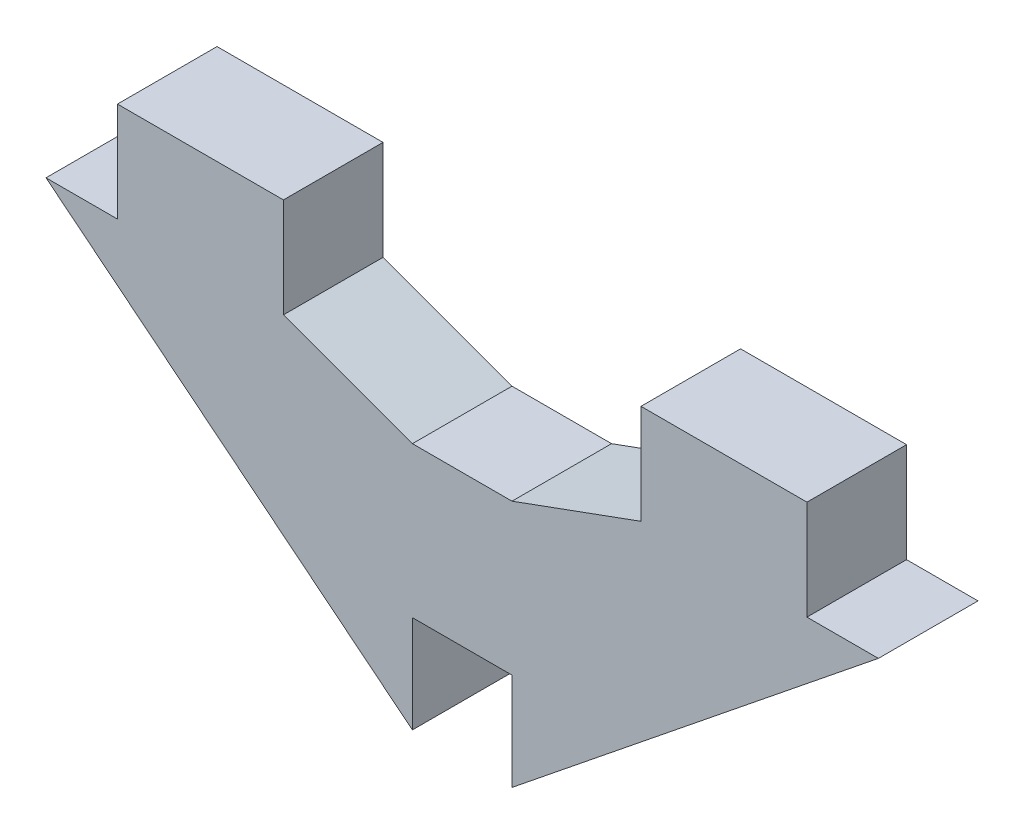
ISO-10303-21;
HEADER;
FILE_DESCRIPTION(('STEP AP214'),'2;1');
FILE_NAME('part.step','',(''),(''),'','','');
FILE_SCHEMA(('AUTOMOTIVE_DESIGN { 1 0 10303 214 1 1 1 1 }'));
ENDSEC;
DATA;
#1=APPLICATION_CONTEXT('core data for automotive mechanical design processes');
#2=APPLICATION_PROTOCOL_DEFINITION('international standard','automotive_design',2000,#1);
#3=PRODUCT_CONTEXT('',#1,'mechanical');
#4=PRODUCT('Part','Part','',(#3));
#5=PRODUCT_RELATED_PRODUCT_CATEGORY('part','',(#4));
#6=PRODUCT_DEFINITION_FORMATION('','',#4);
#7=PRODUCT_DEFINITION_CONTEXT('part definition',#1,'design');
#8=PRODUCT_DEFINITION('design','',#6,#7);
#9=PRODUCT_DEFINITION_SHAPE('','',#8);
#10=(LENGTH_UNIT() NAMED_UNIT(*) SI_UNIT(.MILLI.,.METRE.));
#11=(NAMED_UNIT(*) PLANE_ANGLE_UNIT() SI_UNIT($,.RADIAN.));
#12=(NAMED_UNIT(*) SI_UNIT($,.STERADIAN.) SOLID_ANGLE_UNIT());
#13=UNCERTAINTY_MEASURE_WITH_UNIT(LENGTH_MEASURE(1.E-05),#10,'distance_accuracy_value','');
#14=(GEOMETRIC_REPRESENTATION_CONTEXT(3) GLOBAL_UNCERTAINTY_ASSIGNED_CONTEXT((#13)) GLOBAL_UNIT_ASSIGNED_CONTEXT((#10,
#11,#12)) REPRESENTATION_CONTEXT('',''));
#15=CARTESIAN_POINT('',(0.,0.,0.));
#16=DIRECTION('',(0.,0.,1.));
#17=DIRECTION('',(1.,0.,0.));
#18=AXIS2_PLACEMENT_3D('',#15,#16,#17);
#19=CARTESIAN_POINT('',(1.524,54.2839406039687,1.524));
#20=DIRECTION('',(1.,0.,0.));
#21=DIRECTION('',(0.,0.,-1.));
#22=AXIS2_PLACEMENT_3D('',#19,#20,#21);
#23=PLANE('',#22);
#24=DIRECTION('',(0.,-1.,0.));
#25=VECTOR('',#24,1.);
#26=CARTESIAN_POINT('',(1.524,54.2839406039687,0.));
#27=LINE('',#26,#25);
#28=CARTESIAN_POINT('',(1.524,54.2839406039687,0.));
#29=VERTEX_POINT('',#28);
#30=CARTESIAN_POINT('',(1.524,52.7953081006558,0.));
#31=VERTEX_POINT('',#30);
#32=EDGE_CURVE('E176',#29,#31,#27,.T.);
#33=ORIENTED_EDGE('',*,*,#32,.T.);
#34=DIRECTION('',(0.,0.,-1.));
#35=VECTOR('',#34,1.);
#36=CARTESIAN_POINT('',(1.524,52.7953081006558,1.524));
#37=LINE('',#36,#35);
#38=CARTESIAN_POINT('',(1.524,52.7953081006558,1.524));
#39=VERTEX_POINT('',#38);
#40=EDGE_CURVE('E11',#39,#31,#37,.T.);
#41=ORIENTED_EDGE('',*,*,#40,.F.);
#42=DIRECTION('',(0.,-1.,0.));
#43=VECTOR('',#42,1.);
#44=CARTESIAN_POINT('',(1.524,54.2839406039687,1.524));
#45=LINE('',#44,#43);
#46=CARTESIAN_POINT('',(1.524,54.2839406039687,1.524));
#47=VERTEX_POINT('',#46);
#48=EDGE_CURVE('E206',#47,#39,#45,.T.);
#49=ORIENTED_EDGE('',*,*,#48,.F.);
#50=DIRECTION('',(0.,0.,-1.));
#51=VECTOR('',#50,1.);
#52=CARTESIAN_POINT('',(1.524,54.2839406039687,1.524));
#53=LINE('',#52,#51);
#54=EDGE_CURVE('E172',#47,#29,#53,.T.);
#55=ORIENTED_EDGE('',*,*,#54,.T.);
#56=EDGE_LOOP('',(#33,#41,#49,#55));
#57=FACE_BOUND('',#56,.T.);
#58=ADVANCED_FACE('F32',(#57),#23,.F.);
#59=CARTESIAN_POINT('',(1.524,52.7953081006558,1.524));
#60=DIRECTION('',(-0.627078143312638,0.778956354476664,0.));
#61=DIRECTION('',(-0.778956354476664,-0.627078143312638,0.));
#62=AXIS2_PLACEMENT_3D('',#59,#60,#61);
#63=PLANE('',#62);
#64=DIRECTION('',(0.778956354476664,0.627078143312638,0.));
#65=VECTOR('',#64,1.);
#66=CARTESIAN_POINT('',(1.524,52.7953081006558,0.));
#67=LINE('',#66,#65);
#68=CARTESIAN_POINT('',(7.13130325709699,57.3093187961763,0.));
#69=VERTEX_POINT('',#68);
#70=EDGE_CURVE('E179',#31,#69,#67,.T.);
#71=ORIENTED_EDGE('',*,*,#70,.T.);
#72=DIRECTION('',(0.,0.,-1.));
#73=VECTOR('',#72,1.);
#74=CARTESIAN_POINT('',(7.13130325709699,57.3093187961763,1.524));
#75=LINE('',#74,#73);
#76=CARTESIAN_POINT('',(7.13130325709699,57.3093187961763,1.524));
#77=VERTEX_POINT('',#76);
#78=EDGE_CURVE('E40',#77,#69,#75,.T.);
#79=ORIENTED_EDGE('',*,*,#78,.F.);
#80=DIRECTION('',(0.778956354476664,0.627078143312638,0.));
#81=VECTOR('',#80,1.);
#82=CARTESIAN_POINT('',(1.524,52.7953081006558,1.524));
#83=LINE('',#82,#81);
#84=EDGE_CURVE('E115',#39,#77,#83,.T.);
#85=ORIENTED_EDGE('',*,*,#84,.F.);
#86=ORIENTED_EDGE('',*,*,#40,.T.);
#87=EDGE_LOOP('',(#71,#79,#85,#86));
#88=FACE_BOUND('',#87,.T.);
#89=ADVANCED_FACE('F304',(#88),#63,.F.);
#90=CARTESIAN_POINT('',(7.13130325709699,57.3093187961763,1.524));
#91=DIRECTION('',(0.,-1.,0.));
#92=DIRECTION('',(0.,0.,-1.));
#93=AXIS2_PLACEMENT_3D('',#90,#91,#92);
#94=PLANE('',#93);
#95=DIRECTION('',(-1.,0.,0.));
#96=VECTOR('',#95,1.);
#97=CARTESIAN_POINT('',(7.13130325709699,57.3093187961763,0.));
#98=LINE('',#97,#96);
#99=CARTESIAN_POINT('',(6.03787126377507,57.3093187961763,0.));
#100=VERTEX_POINT('',#99);
#101=EDGE_CURVE('E181',#69,#100,#98,.T.);
#102=ORIENTED_EDGE('',*,*,#101,.T.);
#103=DIRECTION('',(0.,0.,-1.));
#104=VECTOR('',#103,1.);
#105=CARTESIAN_POINT('',(6.03787126377507,57.3093187961763,1.524));
#106=LINE('',#105,#104);
#107=CARTESIAN_POINT('',(6.03787126377507,57.3093187961763,1.524));
#108=VERTEX_POINT('',#107);
#109=EDGE_CURVE('E237',#108,#100,#106,.T.);
#110=ORIENTED_EDGE('',*,*,#109,.F.);
#111=DIRECTION('',(-1.,0.,0.));
#112=VECTOR('',#111,1.);
#113=CARTESIAN_POINT('',(7.13130325709699,57.3093187961763,1.524));
#114=LINE('',#113,#112);
#115=EDGE_CURVE('E245',#77,#108,#114,.T.);
#116=ORIENTED_EDGE('',*,*,#115,.F.);
#117=ORIENTED_EDGE('',*,*,#78,.T.);
#118=EDGE_LOOP('',(#102,#110,#116,#117));
#119=FACE_BOUND('',#118,.T.);
#120=ADVANCED_FACE('F243',(#119),#94,.F.);
#121=CARTESIAN_POINT('',(6.03787126377507,57.3093187961763,1.524));
#122=DIRECTION('',(-1.,0.,0.));
#123=DIRECTION('',(0.,0.,1.));
#124=AXIS2_PLACEMENT_3D('',#121,#122,#123);
#125=PLANE('',#124);
#126=DIRECTION('',(0.,1.,0.));
#127=VECTOR('',#126,1.);
#128=CARTESIAN_POINT('',(6.03787126377507,57.3093187961763,0.));
#129=LINE('',#128,#127);
#130=CARTESIAN_POINT('',(6.03787126377507,58.8333187961763,0.));
#131=VERTEX_POINT('',#130);
#132=EDGE_CURVE('E183',#100,#131,#129,.T.);
#133=ORIENTED_EDGE('',*,*,#132,.T.);
#134=DIRECTION('',(0.,0.,-1.));
#135=VECTOR('',#134,1.);
#136=CARTESIAN_POINT('',(6.03787126377507,58.8333187961763,1.524));
#137=LINE('',#136,#135);
#138=CARTESIAN_POINT('',(6.03787126377507,58.8333187961763,1.524));
#139=VERTEX_POINT('',#138);
#140=EDGE_CURVE('E234',#139,#131,#137,.T.);
#141=ORIENTED_EDGE('',*,*,#140,.F.);
#142=DIRECTION('',(0.,1.,0.));
#143=VECTOR('',#142,1.);
#144=CARTESIAN_POINT('',(6.03787126377507,57.3093187961763,1.524));
#145=LINE('',#144,#143);
#146=EDGE_CURVE('E263',#108,#139,#145,.T.);
#147=ORIENTED_EDGE('',*,*,#146,.F.);
#148=ORIENTED_EDGE('',*,*,#109,.T.);
#149=EDGE_LOOP('',(#133,#141,#147,#148));
#150=FACE_BOUND('',#149,.T.);
#151=ADVANCED_FACE('F254',(#150),#125,.F.);
#152=CARTESIAN_POINT('',(6.03787126377507,58.8333187961763,1.524));
#153=DIRECTION('',(0.,-1.,0.));
#154=DIRECTION('',(0.,0.,-1.));
#155=AXIS2_PLACEMENT_3D('',#152,#153,#154);
#156=PLANE('',#155);
#157=DIRECTION('',(-1.,0.,0.));
#158=VECTOR('',#157,1.);
#159=CARTESIAN_POINT('',(6.03787126377507,58.8333187961763,0.));
#160=LINE('',#159,#158);
#161=CARTESIAN_POINT('',(3.49787126377506,58.8333187961763,0.));
#162=VERTEX_POINT('',#161);
#163=EDGE_CURVE('E185',#131,#162,#160,.T.);
#164=ORIENTED_EDGE('',*,*,#163,.T.);
#165=DIRECTION('',(0.,0.,-1.));
#166=VECTOR('',#165,1.);
#167=CARTESIAN_POINT('',(3.49787126377506,58.8333187961763,1.524));
#168=LINE('',#167,#166);
#169=CARTESIAN_POINT('',(3.49787126377506,58.8333187961763,1.524));
#170=VERTEX_POINT('',#169);
#171=EDGE_CURVE('E231',#170,#162,#168,.T.);
#172=ORIENTED_EDGE('',*,*,#171,.F.);
#173=DIRECTION('',(-1.,0.,0.));
#174=VECTOR('',#173,1.);
#175=CARTESIAN_POINT('',(6.03787126377507,58.8333187961763,1.524));
#176=LINE('',#175,#174);
#177=EDGE_CURVE('E260',#139,#170,#176,.T.);
#178=ORIENTED_EDGE('',*,*,#177,.F.);
#179=ORIENTED_EDGE('',*,*,#140,.T.);
#180=EDGE_LOOP('',(#164,#172,#178,#179));
#181=FACE_BOUND('',#180,.T.);
#182=ADVANCED_FACE('F258',(#181),#156,.F.);
#183=CARTESIAN_POINT('',(3.49787126377506,58.8333187961763,1.524));
#184=DIRECTION('',(1.,0.,0.));
#185=DIRECTION('',(0.,0.,-1.));
#186=AXIS2_PLACEMENT_3D('',#183,#184,#185);
#187=PLANE('',#186);
#188=DIRECTION('',(0.,-1.,0.));
#189=VECTOR('',#188,1.);
#190=CARTESIAN_POINT('',(3.49787126377506,58.8333187961763,0.));
#191=LINE('',#190,#189);
#192=CARTESIAN_POINT('',(3.49787126377506,57.3093187961763,0.));
#193=VERTEX_POINT('',#192);
#194=EDGE_CURVE('E187',#162,#193,#191,.T.);
#195=ORIENTED_EDGE('',*,*,#194,.T.);
#196=DIRECTION('',(0.,0.,-1.));
#197=VECTOR('',#196,1.);
#198=CARTESIAN_POINT('',(3.49787126377506,57.3093187961763,1.524));
#199=LINE('',#198,#197);
#200=CARTESIAN_POINT('',(3.49787126377506,57.3093187961763,1.524));
#201=VERTEX_POINT('',#200);
#202=EDGE_CURVE('E228',#201,#193,#199,.T.);
#203=ORIENTED_EDGE('',*,*,#202,.F.);
#204=DIRECTION('',(0.,-1.,0.));
#205=VECTOR('',#204,1.);
#206=CARTESIAN_POINT('',(3.49787126377506,58.8333187961763,1.524));
#207=LINE('',#206,#205);
#208=EDGE_CURVE('E262',#170,#201,#207,.T.);
#209=ORIENTED_EDGE('',*,*,#208,.F.);
#210=ORIENTED_EDGE('',*,*,#171,.T.);
#211=EDGE_LOOP('',(#195,#203,#209,#210));
#212=FACE_BOUND('',#211,.T.);
#213=ADVANCED_FACE('F317',(#212),#187,.F.);
#214=CARTESIAN_POINT('',(1.524,56.5893477170582,1.524));
#215=DIRECTION('',(0.342667570889591,-0.939456723782755,0.));
#216=DIRECTION('',(0.939456723782755,0.342667570889591,0.));
#217=AXIS2_PLACEMENT_3D('',#214,#215,#216);
#218=PLANE('',#217);
#219=DIRECTION('',(-0.939456723782755,-0.342667570889591,0.));
#220=VECTOR('',#219,1.);
#221=CARTESIAN_POINT('',(1.524,56.5893477170582,0.));
#222=LINE('',#221,#220);
#223=CARTESIAN_POINT('',(1.524,56.5893477170582,0.));
#224=VERTEX_POINT('',#223);
#225=EDGE_CURVE('E189',#193,#224,#222,.T.);
#226=ORIENTED_EDGE('',*,*,#225,.T.);
#227=DIRECTION('',(0.,0.,-1.));
#228=VECTOR('',#227,1.);
#229=CARTESIAN_POINT('',(1.524,56.5893477170582,1.524));
#230=LINE('',#229,#228);
#231=CARTESIAN_POINT('',(1.524,56.5893477170582,1.524));
#232=VERTEX_POINT('',#231);
#233=EDGE_CURVE('E225',#232,#224,#230,.T.);
#234=ORIENTED_EDGE('',*,*,#233,.F.);
#235=DIRECTION('',(-0.939456723782755,-0.342667570889591,0.));
#236=VECTOR('',#235,1.);
#237=CARTESIAN_POINT('',(1.524,56.5893477170582,1.524));
#238=LINE('',#237,#236);
#239=EDGE_CURVE('E265',#201,#232,#238,.T.);
#240=ORIENTED_EDGE('',*,*,#239,.F.);
#241=ORIENTED_EDGE('',*,*,#202,.T.);
#242=EDGE_LOOP('',(#226,#234,#240,#241));
#243=FACE_BOUND('',#242,.T.);
#244=ADVANCED_FACE('F320',(#243),#218,.F.);
#245=CARTESIAN_POINT('',(0.,56.5893477170582,1.524));
#246=DIRECTION('',(0.,-1.,0.));
#247=DIRECTION('',(0.,0.,-1.));
#248=AXIS2_PLACEMENT_3D('',#245,#246,#247);
#249=PLANE('',#248);
#250=DIRECTION('',(-1.,0.,0.));
#251=VECTOR('',#250,1.);
#252=CARTESIAN_POINT('',(0.,56.5893477170582,0.));
#253=LINE('',#252,#251);
#254=CARTESIAN_POINT('',(0.,56.5893477170582,0.));
#255=VERTEX_POINT('',#254);
#256=EDGE_CURVE('E191',#224,#255,#253,.T.);
#257=ORIENTED_EDGE('',*,*,#256,.T.);
#258=DIRECTION('',(0.,0.,-1.));
#259=VECTOR('',#258,1.);
#260=CARTESIAN_POINT('',(0.,56.5893477170582,1.524));
#261=LINE('',#260,#259);
#262=CARTESIAN_POINT('',(0.,56.5893477170582,1.524));
#263=VERTEX_POINT('',#262);
#264=EDGE_CURVE('E222',#263,#255,#261,.T.);
#265=ORIENTED_EDGE('',*,*,#264,.F.);
#266=DIRECTION('',(-1.,0.,0.));
#267=VECTOR('',#266,1.);
#268=CARTESIAN_POINT('',(0.,56.5893477170582,1.524));
#269=LINE('',#268,#267);
#270=EDGE_CURVE('E271',#232,#263,#269,.T.);
#271=ORIENTED_EDGE('',*,*,#270,.F.);
#272=ORIENTED_EDGE('',*,*,#233,.T.);
#273=EDGE_LOOP('',(#257,#265,#271,#272));
#274=FACE_BOUND('',#273,.T.);
#275=ADVANCED_FACE('F324',(#274),#249,.F.);
#276=CARTESIAN_POINT('',(0.,56.5893477170582,1.524));
#277=DIRECTION('',(-0.342667570889591,-0.939456723782755,0.));
#278=DIRECTION('',(0.939456723782755,-0.342667570889591,0.));
#279=AXIS2_PLACEMENT_3D('',#276,#277,#278);
#280=PLANE('',#279);
#281=DIRECTION('',(-0.939456723782755,0.342667570889591,0.));
#282=VECTOR('',#281,1.);
#283=CARTESIAN_POINT('',(0.,56.5893477170582,0.));
#284=LINE('',#283,#282);
#285=CARTESIAN_POINT('',(-1.97387126377506,57.3093187961763,0.));
#286=VERTEX_POINT('',#285);
#287=EDGE_CURVE('E193',#255,#286,#284,.T.);
#288=ORIENTED_EDGE('',*,*,#287,.T.);
#289=DIRECTION('',(0.,0.,-1.));
#290=VECTOR('',#289,1.);
#291=CARTESIAN_POINT('',(-1.97387126377506,57.3093187961763,1.524));
#292=LINE('',#291,#290);
#293=CARTESIAN_POINT('',(-1.97387126377506,57.3093187961763,1.524));
#294=VERTEX_POINT('',#293);
#295=EDGE_CURVE('E219',#294,#286,#292,.T.);
#296=ORIENTED_EDGE('',*,*,#295,.F.);
#297=DIRECTION('',(-0.939456723782755,0.342667570889591,0.));
#298=VECTOR('',#297,1.);
#299=CARTESIAN_POINT('',(0.,56.5893477170582,1.524));
#300=LINE('',#299,#298);
#301=EDGE_CURVE('E273',#263,#294,#300,.T.);
#302=ORIENTED_EDGE('',*,*,#301,.F.);
#303=ORIENTED_EDGE('',*,*,#264,.T.);
#304=EDGE_LOOP('',(#288,#296,#302,#303));
#305=FACE_BOUND('',#304,.T.);
#306=ADVANCED_FACE('F328',(#305),#280,.F.);
#307=CARTESIAN_POINT('',(-1.97387126377506,58.8333187961763,1.524));
#308=DIRECTION('',(-1.,0.,0.));
#309=DIRECTION('',(0.,0.,1.));
#310=AXIS2_PLACEMENT_3D('',#307,#308,#309);
#311=PLANE('',#310);
#312=DIRECTION('',(0.,1.,0.));
#313=VECTOR('',#312,1.);
#314=CARTESIAN_POINT('',(-1.97387126377506,58.8333187961763,0.));
#315=LINE('',#314,#313);
#316=CARTESIAN_POINT('',(-1.97387126377506,58.8333187961763,0.));
#317=VERTEX_POINT('',#316);
#318=EDGE_CURVE('E195',#286,#317,#315,.T.);
#319=ORIENTED_EDGE('',*,*,#318,.T.);
#320=DIRECTION('',(0.,0.,-1.));
#321=VECTOR('',#320,1.);
#322=CARTESIAN_POINT('',(-1.97387126377506,58.8333187961763,1.524));
#323=LINE('',#322,#321);
#324=CARTESIAN_POINT('',(-1.97387126377506,58.8333187961763,1.524));
#325=VERTEX_POINT('',#324);
#326=EDGE_CURVE('E216',#325,#317,#323,.T.);
#327=ORIENTED_EDGE('',*,*,#326,.F.);
#328=DIRECTION('',(0.,1.,0.));
#329=VECTOR('',#328,1.);
#330=CARTESIAN_POINT('',(-1.97387126377506,58.8333187961763,1.524));
#331=LINE('',#330,#329);
#332=EDGE_CURVE('E275',#294,#325,#331,.T.);
#333=ORIENTED_EDGE('',*,*,#332,.F.);
#334=ORIENTED_EDGE('',*,*,#295,.T.);
#335=EDGE_LOOP('',(#319,#327,#333,#334));
#336=FACE_BOUND('',#335,.T.);
#337=ADVANCED_FACE('F332',(#336),#311,.F.);
#338=CARTESIAN_POINT('',(-4.51387126377507,58.8333187961763,1.524));
#339=DIRECTION('',(0.,-1.,0.));
#340=DIRECTION('',(0.,0.,-1.));
#341=AXIS2_PLACEMENT_3D('',#338,#339,#340);
#342=PLANE('',#341);
#343=DIRECTION('',(-1.,0.,0.));
#344=VECTOR('',#343,1.);
#345=CARTESIAN_POINT('',(-4.51387126377507,58.8333187961763,0.));
#346=LINE('',#345,#344);
#347=CARTESIAN_POINT('',(-4.51387126377507,58.8333187961763,0.));
#348=VERTEX_POINT('',#347);
#349=EDGE_CURVE('E197',#317,#348,#346,.T.);
#350=ORIENTED_EDGE('',*,*,#349,.T.);
#351=DIRECTION('',(0.,0.,-1.));
#352=VECTOR('',#351,1.);
#353=CARTESIAN_POINT('',(-4.51387126377507,58.8333187961763,1.524));
#354=LINE('',#353,#352);
#355=CARTESIAN_POINT('',(-4.51387126377507,58.8333187961763,1.524));
#356=VERTEX_POINT('',#355);
#357=EDGE_CURVE('E213',#356,#348,#354,.T.);
#358=ORIENTED_EDGE('',*,*,#357,.F.);
#359=DIRECTION('',(-1.,0.,0.));
#360=VECTOR('',#359,1.);
#361=CARTESIAN_POINT('',(-4.51387126377507,58.8333187961763,1.524));
#362=LINE('',#361,#360);
#363=EDGE_CURVE('E277',#325,#356,#362,.T.);
#364=ORIENTED_EDGE('',*,*,#363,.F.);
#365=ORIENTED_EDGE('',*,*,#326,.T.);
#366=EDGE_LOOP('',(#350,#358,#364,#365));
#367=FACE_BOUND('',#366,.T.);
#368=ADVANCED_FACE('F336',(#367),#342,.F.);
#369=CARTESIAN_POINT('',(-4.51387126377507,57.3093187961763,1.524));
#370=DIRECTION('',(1.,0.,0.));
#371=DIRECTION('',(0.,0.,-1.));
#372=AXIS2_PLACEMENT_3D('',#369,#370,#371);
#373=PLANE('',#372);
#374=DIRECTION('',(0.,-1.,0.));
#375=VECTOR('',#374,1.);
#376=CARTESIAN_POINT('',(-4.51387126377507,57.3093187961763,0.));
#377=LINE('',#376,#375);
#378=CARTESIAN_POINT('',(-4.51387126377507,57.3093187961763,0.));
#379=VERTEX_POINT('',#378);
#380=EDGE_CURVE('E199',#348,#379,#377,.T.);
#381=ORIENTED_EDGE('',*,*,#380,.T.);
#382=DIRECTION('',(0.,0.,-1.));
#383=VECTOR('',#382,1.);
#384=CARTESIAN_POINT('',(-4.51387126377507,57.3093187961763,1.524));
#385=LINE('',#384,#383);
#386=CARTESIAN_POINT('',(-4.51387126377507,57.3093187961763,1.524));
#387=VERTEX_POINT('',#386);
#388=EDGE_CURVE('E210',#387,#379,#385,.T.);
#389=ORIENTED_EDGE('',*,*,#388,.F.);
#390=DIRECTION('',(0.,-1.,0.));
#391=VECTOR('',#390,1.);
#392=CARTESIAN_POINT('',(-4.51387126377507,57.3093187961763,1.524));
#393=LINE('',#392,#391);
#394=EDGE_CURVE('E279',#356,#387,#393,.T.);
#395=ORIENTED_EDGE('',*,*,#394,.F.);
#396=ORIENTED_EDGE('',*,*,#357,.T.);
#397=EDGE_LOOP('',(#381,#389,#395,#396));
#398=FACE_BOUND('',#397,.T.);
#399=ADVANCED_FACE('F285',(#398),#373,.F.);
#400=CARTESIAN_POINT('',(-5.60730325709699,57.3093187961763,1.524));
#401=DIRECTION('',(0.,-1.,0.));
#402=DIRECTION('',(0.,0.,-1.));
#403=AXIS2_PLACEMENT_3D('',#400,#401,#402);
#404=PLANE('',#403);
#405=DIRECTION('',(-1.,0.,0.));
#406=VECTOR('',#405,1.);
#407=CARTESIAN_POINT('',(-5.60730325709699,57.3093187961763,0.));
#408=LINE('',#407,#406);
#409=CARTESIAN_POINT('',(-5.60730325709699,57.3093187961763,0.));
#410=VERTEX_POINT('',#409);
#411=EDGE_CURVE('E201',#379,#410,#408,.T.);
#412=ORIENTED_EDGE('',*,*,#411,.T.);
#413=DIRECTION('',(0.,0.,-1.));
#414=VECTOR('',#413,1.);
#415=CARTESIAN_POINT('',(-5.60730325709699,57.3093187961763,1.524));
#416=LINE('',#415,#414);
#417=CARTESIAN_POINT('',(-5.60730325709699,57.3093187961763,1.524));
#418=VERTEX_POINT('',#417);
#419=EDGE_CURVE('E167',#418,#410,#416,.T.);
#420=ORIENTED_EDGE('',*,*,#419,.F.);
#421=DIRECTION('',(-1.,0.,0.));
#422=VECTOR('',#421,1.);
#423=CARTESIAN_POINT('',(-5.60730325709699,57.3093187961763,1.524));
#424=LINE('',#423,#422);
#425=EDGE_CURVE('E158',#387,#418,#424,.T.);
#426=ORIENTED_EDGE('',*,*,#425,.F.);
#427=ORIENTED_EDGE('',*,*,#388,.T.);
#428=EDGE_LOOP('',(#412,#420,#426,#427));
#429=FACE_BOUND('',#428,.T.);
#430=ADVANCED_FACE('F289',(#429),#404,.F.);
#431=CARTESIAN_POINT('',(0.,52.7953081006558,1.524));
#432=DIRECTION('',(0.627078143312638,0.778956354476664,0.));
#433=DIRECTION('',(-0.778956354476664,0.627078143312638,0.));
#434=AXIS2_PLACEMENT_3D('',#431,#432,#433);
#435=PLANE('',#434);
#436=DIRECTION('',(0.778956354476664,-0.627078143312638,0.));
#437=VECTOR('',#436,1.);
#438=CARTESIAN_POINT('',(0.,52.7953081006558,0.));
#439=LINE('',#438,#437);
#440=CARTESIAN_POINT('',(0.,52.7953081006558,0.));
#441=VERTEX_POINT('',#440);
#442=EDGE_CURVE('E166',#410,#441,#439,.T.);
#443=ORIENTED_EDGE('',*,*,#442,.T.);
#444=DIRECTION('',(0.,0.,-1.));
#445=VECTOR('',#444,1.);
#446=CARTESIAN_POINT('',(0.,52.7953081006558,1.524));
#447=LINE('',#446,#445);
#448=CARTESIAN_POINT('',(0.,52.7953081006558,1.524));
#449=VERTEX_POINT('',#448);
#450=EDGE_CURVE('E163',#449,#441,#447,.T.);
#451=ORIENTED_EDGE('',*,*,#450,.F.);
#452=DIRECTION('',(0.778956354476664,-0.627078143312638,0.));
#453=VECTOR('',#452,1.);
#454=CARTESIAN_POINT('',(0.,52.7953081006558,1.524));
#455=LINE('',#454,#453);
#456=EDGE_CURVE('E152',#418,#449,#455,.T.);
#457=ORIENTED_EDGE('',*,*,#456,.F.);
#458=ORIENTED_EDGE('',*,*,#419,.T.);
#459=EDGE_LOOP('',(#443,#451,#457,#458));
#460=FACE_BOUND('',#459,.T.);
#461=ADVANCED_FACE('F164',(#460),#435,.F.);
#462=CARTESIAN_POINT('',(0.,54.2839406039687,1.524));
#463=DIRECTION('',(-1.,0.,0.));
#464=DIRECTION('',(0.,0.,1.));
#465=AXIS2_PLACEMENT_3D('',#462,#463,#464);
#466=PLANE('',#465);
#467=DIRECTION('',(0.,1.,0.));
#468=VECTOR('',#467,1.);
#469=CARTESIAN_POINT('',(0.,54.2839406039687,0.));
#470=LINE('',#469,#468);
#471=CARTESIAN_POINT('',(0.,54.2839406039687,0.));
#472=VERTEX_POINT('',#471);
#473=EDGE_CURVE('E101',#441,#472,#470,.T.);
#474=ORIENTED_EDGE('',*,*,#473,.T.);
#475=DIRECTION('',(0.,0.,-1.));
#476=VECTOR('',#475,1.);
#477=CARTESIAN_POINT('',(0.,54.2839406039687,1.524));
#478=LINE('',#477,#476);
#479=CARTESIAN_POINT('',(0.,54.2839406039687,1.524));
#480=VERTEX_POINT('',#479);
#481=EDGE_CURVE('E168',#480,#472,#478,.T.);
#482=ORIENTED_EDGE('',*,*,#481,.F.);
#483=DIRECTION('',(0.,1.,0.));
#484=VECTOR('',#483,1.);
#485=CARTESIAN_POINT('',(0.,54.2839406039687,1.524));
#486=LINE('',#485,#484);
#487=EDGE_CURVE('E156',#449,#480,#486,.T.);
#488=ORIENTED_EDGE('',*,*,#487,.F.);
#489=ORIENTED_EDGE('',*,*,#450,.T.);
#490=EDGE_LOOP('',(#474,#482,#488,#489));
#491=FACE_BOUND('',#490,.T.);
#492=ADVANCED_FACE('F170',(#491),#466,.F.);
#493=CARTESIAN_POINT('',(0.,54.2839406039687,1.524));
#494=DIRECTION('',(0.,1.,0.));
#495=DIRECTION('',(0.,0.,1.));
#496=AXIS2_PLACEMENT_3D('',#493,#494,#495);
#497=PLANE('',#496);
#498=DIRECTION('',(1.,0.,0.));
#499=VECTOR('',#498,1.);
#500=CARTESIAN_POINT('',(0.,54.2839406039687,0.));
#501=LINE('',#500,#499);
#502=EDGE_CURVE('E107',#472,#29,#501,.T.);
#503=ORIENTED_EDGE('',*,*,#502,.T.);
#504=ORIENTED_EDGE('',*,*,#54,.F.);
#505=DIRECTION('',(1.,0.,0.));
#506=VECTOR('',#505,1.);
#507=CARTESIAN_POINT('',(0.,54.2839406039687,1.524));
#508=LINE('',#507,#506);
#509=EDGE_CURVE('E48',#480,#47,#508,.T.);
#510=ORIENTED_EDGE('',*,*,#509,.F.);
#511=ORIENTED_EDGE('',*,*,#481,.T.);
#512=EDGE_LOOP('',(#503,#504,#510,#511));
#513=FACE_BOUND('',#512,.T.);
#514=ADVANCED_FACE('F293',(#513),#497,.F.);
#515=CARTESIAN_POINT('',(0.,0.,1.524));
#516=DIRECTION('',(0.,0.,-1.));
#517=DIRECTION('',(-1.,0.,0.));
#518=AXIS2_PLACEMENT_3D('',#515,#516,#517);
#519=PLANE('',#518);
#520=ORIENTED_EDGE('',*,*,#48,.T.);
#521=ORIENTED_EDGE('',*,*,#84,.T.);
#522=ORIENTED_EDGE('',*,*,#115,.T.);
#523=ORIENTED_EDGE('',*,*,#146,.T.);
#524=ORIENTED_EDGE('',*,*,#177,.T.);
#525=ORIENTED_EDGE('',*,*,#208,.T.);
#526=ORIENTED_EDGE('',*,*,#239,.T.);
#527=ORIENTED_EDGE('',*,*,#270,.T.);
#528=ORIENTED_EDGE('',*,*,#301,.T.);
#529=ORIENTED_EDGE('',*,*,#332,.T.);
#530=ORIENTED_EDGE('',*,*,#363,.T.);
#531=ORIENTED_EDGE('',*,*,#394,.T.);
#532=ORIENTED_EDGE('',*,*,#425,.T.);
#533=ORIENTED_EDGE('',*,*,#456,.T.);
#534=ORIENTED_EDGE('',*,*,#487,.T.);
#535=ORIENTED_EDGE('',*,*,#509,.T.);
#536=EDGE_LOOP('',(#520,#521,#522,#523,#524,#525,#526,#527,#528,#529,#530,#531,#532,#533,#534,#535));
#537=FACE_BOUND('',#536,.T.);
#538=ADVANCED_FACE('F154',(#537),#519,.F.);
#539=CARTESIAN_POINT('',(0.,0.,0.));
#540=DIRECTION('',(0.,0.,-1.));
#541=DIRECTION('',(-1.,0.,0.));
#542=AXIS2_PLACEMENT_3D('',#539,#540,#541);
#543=PLANE('',#542);
#544=ORIENTED_EDGE('',*,*,#32,.F.);
#545=ORIENTED_EDGE('',*,*,#502,.F.);
#546=ORIENTED_EDGE('',*,*,#473,.F.);
#547=ORIENTED_EDGE('',*,*,#442,.F.);
#548=ORIENTED_EDGE('',*,*,#411,.F.);
#549=ORIENTED_EDGE('',*,*,#380,.F.);
#550=ORIENTED_EDGE('',*,*,#349,.F.);
#551=ORIENTED_EDGE('',*,*,#318,.F.);
#552=ORIENTED_EDGE('',*,*,#287,.F.);
#553=ORIENTED_EDGE('',*,*,#256,.F.);
#554=ORIENTED_EDGE('',*,*,#225,.F.);
#555=ORIENTED_EDGE('',*,*,#194,.F.);
#556=ORIENTED_EDGE('',*,*,#163,.F.);
#557=ORIENTED_EDGE('',*,*,#132,.F.);
#558=ORIENTED_EDGE('',*,*,#101,.F.);
#559=ORIENTED_EDGE('',*,*,#70,.F.);
#560=EDGE_LOOP('',(#544,#545,#546,#547,#548,#549,#550,#551,#552,#553,#554,#555,#556,#557,#558,#559));
#561=FACE_BOUND('',#560,.T.);
#562=ADVANCED_FACE('F249',(#561),#543,.T.);
#563=CLOSED_SHELL('',(#58,#89,#120,#151,#182,#213,#244,#275,#306,#337,#368,#399,#430,#461,#492,
#514,#538,#562));
#564=MANIFOLD_SOLID_BREP('B2',#563);
#565=ADVANCED_BREP_SHAPE_REPRESENTATION('',(#18,#564),#14);
#566=SHAPE_DEFINITION_REPRESENTATION(#9,#565);
ENDSEC;
END-ISO-10303-21;
